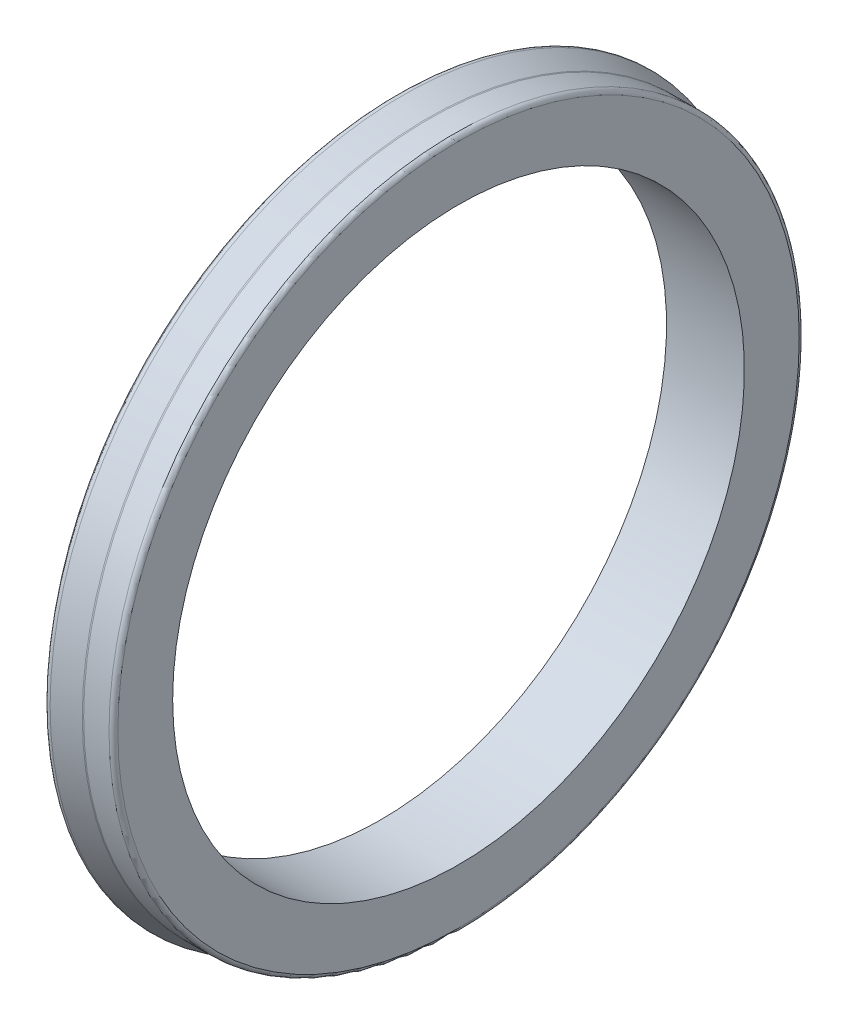
ISO-10303-21;
HEADER;
FILE_DESCRIPTION(('STEP AP214'),'2;1');
FILE_NAME('part.step','',(''),(''),'','','');
FILE_SCHEMA(('AUTOMOTIVE_DESIGN { 1 0 10303 214 1 1 1 1 }'));
ENDSEC;
DATA;
#1=APPLICATION_CONTEXT('core data for automotive mechanical design processes');
#2=APPLICATION_PROTOCOL_DEFINITION('international standard','automotive_design',2000,#1);
#3=PRODUCT_CONTEXT('',#1,'mechanical');
#4=PRODUCT('Part','Part','',(#3));
#5=PRODUCT_RELATED_PRODUCT_CATEGORY('part','',(#4));
#6=PRODUCT_DEFINITION_FORMATION('','',#4);
#7=PRODUCT_DEFINITION_CONTEXT('part definition',#1,'design');
#8=PRODUCT_DEFINITION('design','',#6,#7);
#9=PRODUCT_DEFINITION_SHAPE('','',#8);
#10=(LENGTH_UNIT() NAMED_UNIT(*) SI_UNIT(.MILLI.,.METRE.));
#11=(NAMED_UNIT(*) PLANE_ANGLE_UNIT() SI_UNIT($,.RADIAN.));
#12=(NAMED_UNIT(*) SI_UNIT($,.STERADIAN.) SOLID_ANGLE_UNIT());
#13=UNCERTAINTY_MEASURE_WITH_UNIT(LENGTH_MEASURE(1.E-05),#10,'distance_accuracy_value','');
#14=(GEOMETRIC_REPRESENTATION_CONTEXT(3) GLOBAL_UNCERTAINTY_ASSIGNED_CONTEXT((#13)) GLOBAL_UNIT_ASSIGNED_CONTEXT((#10,
#11,#12)) REPRESENTATION_CONTEXT('',''));
#15=CARTESIAN_POINT('',(0.,0.,0.));
#16=DIRECTION('',(0.,0.,1.));
#17=DIRECTION('',(1.,0.,0.));
#18=AXIS2_PLACEMENT_3D('',#15,#16,#17);
#19=CARTESIAN_POINT('',(-6.29899548627758,0.,-13.9109311906584));
#20=DIRECTION('',(1.,0.,0.));
#21=DIRECTION('',(0.,0.,-1.));
#22=AXIS2_PLACEMENT_3D('',#19,#20,#21);
#23=PLANE('',#22);
#24=CARTESIAN_POINT('',(-6.29899548627758,0.,0.));
#25=DIRECTION('',(-1.,0.,0.));
#26=DIRECTION('',(0.,0.,1.));
#27=AXIS2_PLACEMENT_3D('',#24,#25,#26);
#28=CIRCLE('',#27,12.9508090667143);
#29=CARTESIAN_POINT('',(-6.29899548627758,0.,12.9508090667143));
#30=VERTEX_POINT('',#29);
#31=EDGE_CURVE('E12',#30,#30,#28,.T.);
#32=ORIENTED_EDGE('',*,*,#31,.F.);
#33=EDGE_LOOP('',(#32));
#34=FACE_BOUND('',#33,.T.);
#35=CARTESIAN_POINT('',(-6.29899548627758,0.,0.));
#36=DIRECTION('',(-1.,0.,0.));
#37=DIRECTION('',(0.,0.,1.));
#38=AXIS2_PLACEMENT_3D('',#35,#36,#37);
#39=CIRCLE('',#38,13.9109311906584);
#40=CARTESIAN_POINT('',(-6.29899548627758,0.,13.9109311906584));
#41=VERTEX_POINT('',#40);
#42=EDGE_CURVE('E88',#41,#41,#39,.T.);
#43=ORIENTED_EDGE('',*,*,#42,.T.);
#44=EDGE_LOOP('',(#43));
#45=FACE_BOUND('',#44,.T.);
#46=ADVANCED_FACE('F42',(#34,#45),#23,.F.);
#47=CARTESIAN_POINT('',(0.,0.,0.));
#48=DIRECTION('',(-1.,0.,0.));
#49=DIRECTION('',(0.,0.,1.));
#50=AXIS2_PLACEMENT_3D('',#47,#48,#49);
#51=CYLINDRICAL_SURFACE('',#50,12.9508090667143);
#52=CARTESIAN_POINT('',(-2.77200508423334,0.,0.));
#53=DIRECTION('',(-1.,0.,0.));
#54=DIRECTION('',(0.,0.,1.));
#55=AXIS2_PLACEMENT_3D('',#52,#53,#54);
#56=CIRCLE('',#55,12.9508090667143);
#57=CARTESIAN_POINT('',(-2.77200508423334,0.,12.9508090667143));
#58=VERTEX_POINT('',#57);
#59=EDGE_CURVE('E48',#58,#58,#56,.T.);
#60=ORIENTED_EDGE('',*,*,#59,.F.);
#61=EDGE_LOOP('',(#60));
#62=FACE_BOUND('',#61,.T.);
#63=ORIENTED_EDGE('',*,*,#31,.T.);
#64=EDGE_LOOP('',(#63));
#65=FACE_BOUND('',#64,.T.);
#66=ADVANCED_FACE('F161',(#62,#65),#51,.F.);
#67=CARTESIAN_POINT('',(-2.77200508423334,0.,-12.9508090667143));
#68=DIRECTION('',(-1.,0.,0.));
#69=DIRECTION('',(0.,0.,1.));
#70=AXIS2_PLACEMENT_3D('',#67,#68,#69);
#71=PLANE('',#70);
#72=CARTESIAN_POINT('',(-2.77200508423334,0.,0.));
#73=DIRECTION('',(-1.,0.,0.));
#74=DIRECTION('',(0.,0.,1.));
#75=AXIS2_PLACEMENT_3D('',#72,#73,#74);
#76=CIRCLE('',#75,15.4348709449995);
#77=CARTESIAN_POINT('',(-2.77200508423334,0.,15.4348709449995));
#78=VERTEX_POINT('',#77);
#79=EDGE_CURVE('E52',#78,#78,#76,.T.);
#80=ORIENTED_EDGE('',*,*,#79,.F.);
#81=EDGE_LOOP('',(#80));
#82=FACE_BOUND('',#81,.T.);
#83=ORIENTED_EDGE('',*,*,#59,.T.);
#84=EDGE_LOOP('',(#83));
#85=FACE_BOUND('',#84,.T.);
#86=ADVANCED_FACE('F156',(#82,#85),#71,.F.);
#87=CARTESIAN_POINT('',(-2.97200508423334,0.,0.));
#88=DIRECTION('',(-1.,0.,0.));
#89=DIRECTION('',(0.,0.,1.));
#90=AXIS2_PLACEMENT_3D('',#87,#88,#89);
#91=TOROIDAL_SURFACE('',#90,15.4348709449995,0.2);
#92=CARTESIAN_POINT('',(-2.97200508423334,0.,0.));
#93=DIRECTION('',(-1.,0.,0.));
#94=DIRECTION('',(0.,0.,1.));
#95=AXIS2_PLACEMENT_3D('',#92,#93,#94);
#96=CIRCLE('',#95,15.6348709449995);
#97=CARTESIAN_POINT('',(-2.97200508423334,0.,15.6348709449995));
#98=VERTEX_POINT('',#97);
#99=EDGE_CURVE('E56',#98,#98,#96,.T.);
#100=ORIENTED_EDGE('',*,*,#99,.F.);
#101=EDGE_LOOP('',(#100));
#102=FACE_BOUND('',#101,.T.);
#103=ORIENTED_EDGE('',*,*,#79,.T.);
#104=EDGE_LOOP('',(#103));
#105=FACE_BOUND('',#104,.T.);
#106=ADVANCED_FACE('F150',(#102,#105),#91,.T.);
#107=CARTESIAN_POINT('',(0.,0.,0.));
#108=DIRECTION('',(-1.,0.,0.));
#109=DIRECTION('',(0.,0.,1.));
#110=AXIS2_PLACEMENT_3D('',#107,#108,#109);
#111=CYLINDRICAL_SURFACE('',#110,15.6348709449995);
#112=CARTESIAN_POINT('',(-4.1194791208502,0.,0.));
#113=DIRECTION('',(-1.,0.,0.));
#114=DIRECTION('',(0.,0.,1.));
#115=AXIS2_PLACEMENT_3D('',#112,#113,#114);
#116=CIRCLE('',#115,15.6348709449995);
#117=CARTESIAN_POINT('',(-4.1194791208502,0.,15.6348709449995));
#118=VERTEX_POINT('',#117);
#119=EDGE_CURVE('E61',#118,#118,#116,.T.);
#120=ORIENTED_EDGE('',*,*,#119,.F.);
#121=EDGE_LOOP('',(#120));
#122=FACE_BOUND('',#121,.T.);
#123=ORIENTED_EDGE('',*,*,#99,.T.);
#124=EDGE_LOOP('',(#123));
#125=FACE_BOUND('',#124,.T.);
#126=ADVANCED_FACE('F144',(#122,#125),#111,.T.);
#127=CARTESIAN_POINT('',(-4.1194791208502,0.,0.));
#128=DIRECTION('',(-1.,0.,0.));
#129=DIRECTION('',(0.,0.,1.));
#130=AXIS2_PLACEMENT_3D('',#127,#128,#129);
#131=TOROIDAL_SURFACE('',#130,15.8348709449995,0.199999999999998);
#132=CARTESIAN_POINT('',(-4.17408261221292,0.,0.));
#133=DIRECTION('',(-1.,0.,0.));
#134=DIRECTION('',(0.,0.,1.));
#135=AXIS2_PLACEMENT_3D('',#132,#133,#134);
#136=CIRCLE('',#135,15.6424691291791);
#137=CARTESIAN_POINT('',(-4.17408261221292,0.,15.6424691291791));
#138=VERTEX_POINT('',#137);
#139=EDGE_CURVE('E64',#138,#138,#136,.T.);
#140=ORIENTED_EDGE('',*,*,#139,.F.);
#141=EDGE_LOOP('',(#140));
#142=FACE_BOUND('',#141,.T.);
#143=ORIENTED_EDGE('',*,*,#119,.T.);
#144=EDGE_LOOP('',(#143));
#145=FACE_BOUND('',#144,.T.);
#146=ADVANCED_FACE('F138',(#142,#145),#131,.F.);
#147=CARTESIAN_POINT('',(-4.17408261221292,0.,0.));
#148=DIRECTION('',(-1.,0.,0.));
#149=DIRECTION('',(0.,0.,1.));
#150=AXIS2_PLACEMENT_3D('',#147,#148,#149);
#151=CONICAL_SURFACE('',#150,15.6424691291791,0.276528261670393);
#152=CARTESIAN_POINT('',(-5.30918713132894,0.,0.));
#153=DIRECTION('',(-1.,0.,0.));
#154=DIRECTION('',(0.,0.,1.));
#155=AXIS2_PLACEMENT_3D('',#152,#153,#154);
#156=CIRCLE('',#155,15.9646109423476);
#157=CARTESIAN_POINT('',(-5.30918713132894,0.,15.9646109423476));
#158=VERTEX_POINT('',#157);
#159=EDGE_CURVE('E67',#158,#158,#156,.T.);
#160=ORIENTED_EDGE('',*,*,#159,.F.);
#161=EDGE_LOOP('',(#160));
#162=FACE_BOUND('',#161,.T.);
#163=ORIENTED_EDGE('',*,*,#139,.T.);
#164=EDGE_LOOP('',(#163));
#165=FACE_BOUND('',#164,.T.);
#166=ADVANCED_FACE('F132',(#162,#165),#151,.T.);
#167=CARTESIAN_POINT('',(-5.36379062269166,0.,0.));
#168=DIRECTION('',(-1.,0.,0.));
#169=DIRECTION('',(0.,0.,1.));
#170=AXIS2_PLACEMENT_3D('',#167,#168,#169);
#171=TOROIDAL_SURFACE('',#170,15.7722091265272,0.199999999999999);
#172=CARTESIAN_POINT('',(-5.51711485276615,0.,0.));
#173=DIRECTION('',(-1.,0.,0.));
#174=DIRECTION('',(0.,0.,1.));
#175=AXIS2_PLACEMENT_3D('',#172,#173,#174);
#176=CIRCLE('',#175,15.9006290645121);
#177=CARTESIAN_POINT('',(-5.51711485276615,0.,15.9006290645121));
#178=VERTEX_POINT('',#177);
#179=EDGE_CURVE('E70',#178,#178,#176,.T.);
#180=ORIENTED_EDGE('',*,*,#179,.F.);
#181=EDGE_LOOP('',(#180));
#182=FACE_BOUND('',#181,.T.);
#183=ORIENTED_EDGE('',*,*,#159,.T.);
#184=EDGE_LOOP('',(#183));
#185=FACE_BOUND('',#184,.T.);
#186=ADVANCED_FACE('F126',(#182,#185),#171,.T.);
#187=CARTESIAN_POINT('',(-5.51711485276615,0.,0.));
#188=DIRECTION('',(1.,0.,0.));
#189=DIRECTION('',(0.,0.,-1.));
#190=AXIS2_PLACEMENT_3D('',#187,#188,#189);
#191=CONICAL_SURFACE('',#190,15.9006290645121,0.873562303505466);
#192=CARTESIAN_POINT('',(-5.75809755589582,0.,0.));
#193=DIRECTION('',(-1.,0.,0.));
#194=DIRECTION('',(0.,0.,1.));
#195=AXIS2_PLACEMENT_3D('',#192,#193,#194);
#196=CIRCLE('',#195,15.6129129357054);
#197=CARTESIAN_POINT('',(-5.75809755589582,0.,15.6129129357054));
#198=VERTEX_POINT('',#197);
#199=EDGE_CURVE('E73',#198,#198,#196,.T.);
#200=ORIENTED_EDGE('',*,*,#199,.F.);
#201=EDGE_LOOP('',(#200));
#202=FACE_BOUND('',#201,.T.);
#203=ORIENTED_EDGE('',*,*,#179,.T.);
#204=EDGE_LOOP('',(#203));
#205=FACE_BOUND('',#204,.T.);
#206=ADVANCED_FACE('F120',(#202,#205),#191,.T.);
#207=CARTESIAN_POINT('',(-5.60477332582132,0.,0.));
#208=DIRECTION('',(-1.,0.,0.));
#209=DIRECTION('',(0.,0.,1.));
#210=AXIS2_PLACEMENT_3D('',#207,#208,#209);
#211=TOROIDAL_SURFACE('',#210,15.4844929977205,0.2);
#212=CARTESIAN_POINT('',(-5.67054285523225,0.,0.));
#213=DIRECTION('',(-1.,0.,0.));
#214=DIRECTION('',(0.,0.,1.));
#215=AXIS2_PLACEMENT_3D('',#212,#213,#214);
#216=CIRCLE('',#215,15.2956164004378);
#217=CARTESIAN_POINT('',(-5.67054285523225,0.,15.2956164004378));
#218=VERTEX_POINT('',#217);
#219=EDGE_CURVE('E76',#218,#218,#216,.T.);
#220=ORIENTED_EDGE('',*,*,#219,.F.);
#221=EDGE_LOOP('',(#220));
#222=FACE_BOUND('',#221,.T.);
#223=ORIENTED_EDGE('',*,*,#199,.T.);
#224=EDGE_LOOP('',(#223));
#225=FACE_BOUND('',#224,.T.);
#226=ADVANCED_FACE('F114',(#222,#225),#211,.T.);
#227=CARTESIAN_POINT('',(-5.67054285523225,0.,0.));
#228=DIRECTION('',(-1.,0.,0.));
#229=DIRECTION('',(0.,0.,1.));
#230=AXIS2_PLACEMENT_3D('',#227,#228,#229);
#231=CONICAL_SURFACE('',#230,15.2956164004378,0.335083097690788);
#232=CARTESIAN_POINT('',(-4.21496704908936,0.,0.));
#233=DIRECTION('',(-1.,0.,0.));
#234=DIRECTION('',(0.,0.,1.));
#235=AXIS2_PLACEMENT_3D('',#232,#233,#234);
#236=CIRCLE('',#235,14.7887641107988);
#237=CARTESIAN_POINT('',(-4.21496704908936,0.,14.7887641107988));
#238=VERTEX_POINT('',#237);
#239=EDGE_CURVE('E79',#238,#238,#236,.T.);
#240=ORIENTED_EDGE('',*,*,#239,.F.);
#241=EDGE_LOOP('',(#240));
#242=FACE_BOUND('',#241,.T.);
#243=ORIENTED_EDGE('',*,*,#219,.T.);
#244=EDGE_LOOP('',(#243));
#245=FACE_BOUND('',#244,.T.);
#246=ADVANCED_FACE('F108',(#242,#245),#231,.F.);
#247=CARTESIAN_POINT('',(-4.28073657850025,0.,0.));
#248=DIRECTION('',(-1.,0.,0.));
#249=DIRECTION('',(0.,0.,1.));
#250=AXIS2_PLACEMENT_3D('',#247,#248,#249);
#251=TOROIDAL_SURFACE('',#250,14.5998875135162,0.2);
#252=CARTESIAN_POINT('',(-4.24986120244555,0.,0.));
#253=DIRECTION('',(-1.,0.,0.));
#254=DIRECTION('',(0.,0.,1.));
#255=AXIS2_PLACEMENT_3D('',#252,#253,#254);
#256=CIRCLE('',#255,14.4022851067659);
#257=CARTESIAN_POINT('',(-4.24986120244555,0.,14.4022851067659));
#258=VERTEX_POINT('',#257);
#259=EDGE_CURVE('E82',#258,#258,#256,.T.);
#260=ORIENTED_EDGE('',*,*,#259,.F.);
#261=EDGE_LOOP('',(#260));
#262=FACE_BOUND('',#261,.T.);
#263=ORIENTED_EDGE('',*,*,#239,.T.);
#264=EDGE_LOOP('',(#263));
#265=FACE_BOUND('',#264,.T.);
#266=ADVANCED_FACE('F102',(#262,#265),#251,.F.);
#267=CARTESIAN_POINT('',(-4.24986120244555,0.,0.));
#268=DIRECTION('',(1.,0.,0.));
#269=DIRECTION('',(0.,0.,-1.));
#270=AXIS2_PLACEMENT_3D('',#267,#268,#269);
#271=CONICAL_SURFACE('',#270,14.4022851067659,0.15499674192394);
#272=CARTESIAN_POINT('',(-6.12987086233227,0.,0.));
#273=DIRECTION('',(-1.,0.,0.));
#274=DIRECTION('',(0.,0.,1.));
#275=AXIS2_PLACEMENT_3D('',#272,#273,#274);
#276=CIRCLE('',#275,14.1085335974086);
#277=CARTESIAN_POINT('',(-6.12987086233227,0.,14.1085335974086));
#278=VERTEX_POINT('',#277);
#279=EDGE_CURVE('E85',#278,#278,#276,.T.);
#280=ORIENTED_EDGE('',*,*,#279,.F.);
#281=EDGE_LOOP('',(#280));
#282=FACE_BOUND('',#281,.T.);
#283=ORIENTED_EDGE('',*,*,#259,.T.);
#284=EDGE_LOOP('',(#283));
#285=FACE_BOUND('',#284,.T.);
#286=ADVANCED_FACE('F96',(#282,#285),#271,.T.);
#287=CARTESIAN_POINT('',(-6.09899548627757,0.,0.));
#288=DIRECTION('',(-1.,0.,0.));
#289=DIRECTION('',(0.,0.,1.));
#290=AXIS2_PLACEMENT_3D('',#287,#288,#289);
#291=TOROIDAL_SURFACE('',#290,13.9109311906584,0.2);
#292=ORIENTED_EDGE('',*,*,#42,.F.);
#293=EDGE_LOOP('',(#292));
#294=FACE_BOUND('',#293,.T.);
#295=ORIENTED_EDGE('',*,*,#279,.T.);
#296=EDGE_LOOP('',(#295));
#297=FACE_BOUND('',#296,.T.);
#298=ADVANCED_FACE('F93',(#294,#297),#291,.T.);
#299=CLOSED_SHELL('',(#46,#66,#86,#106,#126,#146,#166,#186,#206,#226,#246,#266,#286,#298));
#300=MANIFOLD_SOLID_BREP('B2',#299);
#301=ADVANCED_BREP_SHAPE_REPRESENTATION('',(#18,#300),#14);
#302=SHAPE_DEFINITION_REPRESENTATION(#9,#301);
ENDSEC;
END-ISO-10303-21;
